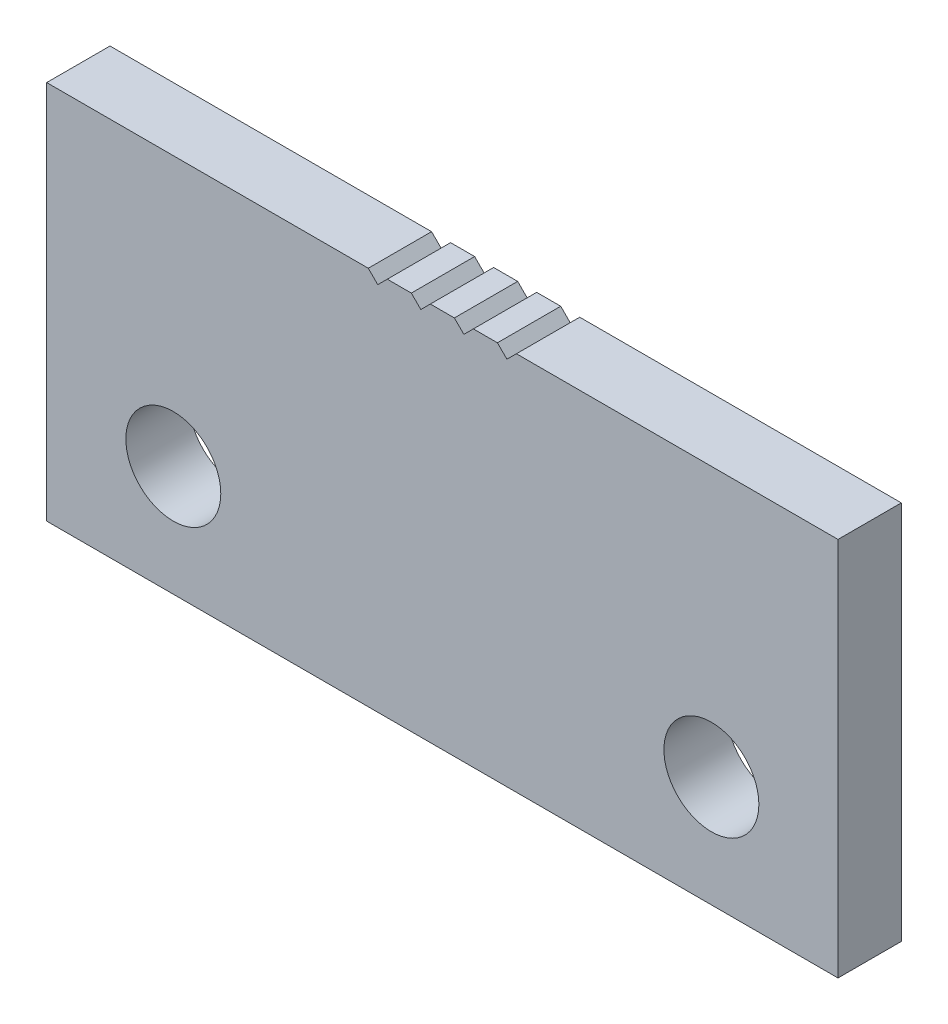
ISO-10303-21;
HEADER;
FILE_DESCRIPTION(('STEP AP214'),'2;1');
FILE_NAME('part.step','',(''),(''),'','','');
FILE_SCHEMA(('AUTOMOTIVE_DESIGN { 1 0 10303 214 1 1 1 1 }'));
ENDSEC;
DATA;
#1=APPLICATION_CONTEXT('core data for automotive mechanical design processes');
#2=APPLICATION_PROTOCOL_DEFINITION('international standard','automotive_design',2000,#1);
#3=PRODUCT_CONTEXT('',#1,'mechanical');
#4=PRODUCT('Part','Part','',(#3));
#5=PRODUCT_RELATED_PRODUCT_CATEGORY('part','',(#4));
#6=PRODUCT_DEFINITION_FORMATION('','',#4);
#7=PRODUCT_DEFINITION_CONTEXT('part definition',#1,'design');
#8=PRODUCT_DEFINITION('design','',#6,#7);
#9=PRODUCT_DEFINITION_SHAPE('','',#8);
#10=(LENGTH_UNIT() NAMED_UNIT(*) SI_UNIT(.MILLI.,.METRE.));
#11=(NAMED_UNIT(*) PLANE_ANGLE_UNIT() SI_UNIT($,.RADIAN.));
#12=(NAMED_UNIT(*) SI_UNIT($,.STERADIAN.) SOLID_ANGLE_UNIT());
#13=UNCERTAINTY_MEASURE_WITH_UNIT(LENGTH_MEASURE(1.E-05),#10,'distance_accuracy_value','');
#14=(GEOMETRIC_REPRESENTATION_CONTEXT(3) GLOBAL_UNCERTAINTY_ASSIGNED_CONTEXT((#13)) GLOBAL_UNIT_ASSIGNED_CONTEXT((#10,
#11,#12)) REPRESENTATION_CONTEXT('',''));
#15=CARTESIAN_POINT('',(0.,0.,0.));
#16=DIRECTION('',(0.,0.,1.));
#17=DIRECTION('',(1.,0.,0.));
#18=AXIS2_PLACEMENT_3D('',#15,#16,#17);
#19=CARTESIAN_POINT('',(0.,0.,2.));
#20=DIRECTION('',(0.,0.,1.));
#21=DIRECTION('',(1.,0.,0.));
#22=AXIS2_PLACEMENT_3D('',#19,#20,#21);
#23=PLANE('',#22);
#24=CARTESIAN_POINT('',(8.5,-2.50000000000001,2.));
#25=DIRECTION('',(0.,0.,1.));
#26=DIRECTION('',(1.,0.,0.));
#27=AXIS2_PLACEMENT_3D('',#24,#25,#26);
#28=CIRCLE('',#27,1.5);
#29=CARTESIAN_POINT('',(10.,-2.50000000000001,2.));
#30=VERTEX_POINT('',#29);
#31=EDGE_CURVE('E198',#30,#30,#28,.T.);
#32=ORIENTED_EDGE('',*,*,#31,.F.);
#33=EDGE_LOOP('',(#32));
#34=FACE_BOUND('',#33,.T.);
#35=DIRECTION('',(-1.,0.,0.));
#36=VECTOR('',#35,1.);
#37=CARTESIAN_POINT('',(2.34,5.99999999999999,2.));
#38=LINE('',#37,#36);
#39=CARTESIAN_POINT('',(12.5,5.99999999999999,2.));
#40=VERTEX_POINT('',#39);
#41=CARTESIAN_POINT('',(2.34,5.99999999999999,2.));
#42=VERTEX_POINT('',#41);
#43=EDGE_CURVE('E240',#40,#42,#38,.T.);
#44=ORIENTED_EDGE('',*,*,#43,.T.);
#45=DIRECTION('',(-0.707106781186549,-0.707106781186547,0.));
#46=VECTOR('',#45,1.);
#47=CARTESIAN_POINT('',(2.04,5.69999999999999,2.));
#48=LINE('',#47,#46);
#49=CARTESIAN_POINT('',(2.04,5.69999999999999,2.));
#50=VERTEX_POINT('',#49);
#51=EDGE_CURVE('E128',#42,#50,#48,.T.);
#52=ORIENTED_EDGE('',*,*,#51,.T.);
#53=DIRECTION('',(-0.707106781186547,0.707106781186547,0.));
#54=VECTOR('',#53,1.);
#55=CARTESIAN_POINT('',(1.74,5.99999999999999,2.));
#56=LINE('',#55,#54);
#57=CARTESIAN_POINT('',(1.74,5.99999999999999,2.));
#58=VERTEX_POINT('',#57);
#59=EDGE_CURVE('E293',#50,#58,#56,.T.);
#60=ORIENTED_EDGE('',*,*,#59,.T.);
#61=DIRECTION('',(-1.,0.,0.));
#62=VECTOR('',#61,1.);
#63=CARTESIAN_POINT('',(0.980000000000001,5.99999999999999,2.));
#64=LINE('',#63,#62);
#65=CARTESIAN_POINT('',(0.980000000000001,5.99999999999999,2.));
#66=VERTEX_POINT('',#65);
#67=EDGE_CURVE('E313',#58,#66,#64,.T.);
#68=ORIENTED_EDGE('',*,*,#67,.T.);
#69=DIRECTION('',(-0.707106781186549,-0.707106781186547,0.));
#70=VECTOR('',#69,1.);
#71=CARTESIAN_POINT('',(0.68,5.69999999999999,2.));
#72=LINE('',#71,#70);
#73=CARTESIAN_POINT('',(0.68,5.69999999999999,2.));
#74=VERTEX_POINT('',#73);
#75=EDGE_CURVE('E309',#66,#74,#72,.T.);
#76=ORIENTED_EDGE('',*,*,#75,.T.);
#77=DIRECTION('',(-0.707106781186547,0.707106781186547,0.));
#78=VECTOR('',#77,1.);
#79=CARTESIAN_POINT('',(0.38,5.99999999999999,2.));
#80=LINE('',#79,#78);
#81=CARTESIAN_POINT('',(0.38,5.99999999999999,2.));
#82=VERTEX_POINT('',#81);
#83=EDGE_CURVE('E312',#74,#82,#80,.T.);
#84=ORIENTED_EDGE('',*,*,#83,.T.);
#85=DIRECTION('',(-1.,0.,0.));
#86=VECTOR('',#85,1.);
#87=CARTESIAN_POINT('',(-0.379999999999999,5.99999999999999,2.));
#88=LINE('',#87,#86);
#89=CARTESIAN_POINT('',(-0.379999999999999,5.99999999999999,2.));
#90=VERTEX_POINT('',#89);
#91=EDGE_CURVE('E317',#82,#90,#88,.T.);
#92=ORIENTED_EDGE('',*,*,#91,.T.);
#93=DIRECTION('',(-0.707106781186549,-0.707106781186547,0.));
#94=VECTOR('',#93,1.);
#95=CARTESIAN_POINT('',(-0.68,5.69999999999999,2.));
#96=LINE('',#95,#94);
#97=CARTESIAN_POINT('',(-0.68,5.69999999999999,2.));
#98=VERTEX_POINT('',#97);
#99=EDGE_CURVE('E324',#90,#98,#96,.T.);
#100=ORIENTED_EDGE('',*,*,#99,.T.);
#101=DIRECTION('',(-0.707106781186547,0.707106781186547,0.));
#102=VECTOR('',#101,1.);
#103=CARTESIAN_POINT('',(-0.98,5.99999999999999,2.));
#104=LINE('',#103,#102);
#105=CARTESIAN_POINT('',(-0.98,5.99999999999999,2.));
#106=VERTEX_POINT('',#105);
#107=EDGE_CURVE('E327',#98,#106,#104,.T.);
#108=ORIENTED_EDGE('',*,*,#107,.T.);
#109=DIRECTION('',(-1.,0.,0.));
#110=VECTOR('',#109,1.);
#111=CARTESIAN_POINT('',(-1.74,5.99999999999999,2.));
#112=LINE('',#111,#110);
#113=CARTESIAN_POINT('',(-1.74,5.99999999999999,2.));
#114=VERTEX_POINT('',#113);
#115=EDGE_CURVE('E330',#106,#114,#112,.T.);
#116=ORIENTED_EDGE('',*,*,#115,.T.);
#117=DIRECTION('',(-0.707106781186549,-0.707106781186547,0.));
#118=VECTOR('',#117,1.);
#119=CARTESIAN_POINT('',(-2.04,5.69999999999999,2.));
#120=LINE('',#119,#118);
#121=CARTESIAN_POINT('',(-2.04,5.69999999999999,2.));
#122=VERTEX_POINT('',#121);
#123=EDGE_CURVE('E333',#114,#122,#120,.T.);
#124=ORIENTED_EDGE('',*,*,#123,.T.);
#125=DIRECTION('',(-0.707106781186547,0.707106781186547,0.));
#126=VECTOR('',#125,1.);
#127=CARTESIAN_POINT('',(-2.34,5.99999999999999,2.));
#128=LINE('',#127,#126);
#129=CARTESIAN_POINT('',(-2.34,5.99999999999999,2.));
#130=VERTEX_POINT('',#129);
#131=EDGE_CURVE('E336',#122,#130,#128,.T.);
#132=ORIENTED_EDGE('',*,*,#131,.T.);
#133=DIRECTION('',(-1.,0.,0.));
#134=VECTOR('',#133,1.);
#135=CARTESIAN_POINT('',(-12.5,5.99999999999999,2.));
#136=LINE('',#135,#134);
#137=CARTESIAN_POINT('',(-12.5,5.99999999999999,2.));
#138=VERTEX_POINT('',#137);
#139=EDGE_CURVE('E171',#130,#138,#136,.T.);
#140=ORIENTED_EDGE('',*,*,#139,.T.);
#141=DIRECTION('',(0.,-1.,0.));
#142=VECTOR('',#141,1.);
#143=CARTESIAN_POINT('',(-12.5,-6.00000000000001,2.));
#144=LINE('',#143,#142);
#145=CARTESIAN_POINT('',(-12.5,-6.00000000000001,2.));
#146=VERTEX_POINT('',#145);
#147=EDGE_CURVE('E165',#138,#146,#144,.T.);
#148=ORIENTED_EDGE('',*,*,#147,.T.);
#149=DIRECTION('',(1.,0.,0.));
#150=VECTOR('',#149,1.);
#151=CARTESIAN_POINT('',(-12.5,-6.00000000000001,2.));
#152=LINE('',#151,#150);
#153=CARTESIAN_POINT('',(12.5,-6.00000000000001,2.));
#154=VERTEX_POINT('',#153);
#155=EDGE_CURVE('E169',#146,#154,#152,.T.);
#156=ORIENTED_EDGE('',*,*,#155,.T.);
#157=DIRECTION('',(0.,1.,0.));
#158=VECTOR('',#157,1.);
#159=CARTESIAN_POINT('',(12.5,-6.00000000000001,2.));
#160=LINE('',#159,#158);
#161=EDGE_CURVE('E61',#154,#40,#160,.T.);
#162=ORIENTED_EDGE('',*,*,#161,.T.);
#163=EDGE_LOOP('',(#44,#52,#60,#68,#76,#84,#92,#100,#108,#116,#124,#132,#140,#148,#156,#162));
#164=FACE_BOUND('',#163,.T.);
#165=CARTESIAN_POINT('',(-8.5,-2.50000000000001,2.));
#166=DIRECTION('',(0.,0.,1.));
#167=DIRECTION('',(1.,0.,0.));
#168=AXIS2_PLACEMENT_3D('',#165,#166,#167);
#169=CIRCLE('',#168,1.5);
#170=CARTESIAN_POINT('',(-7.,-2.50000000000001,2.));
#171=VERTEX_POINT('',#170);
#172=EDGE_CURVE('E380',#171,#171,#169,.T.);
#173=ORIENTED_EDGE('',*,*,#172,.F.);
#174=EDGE_LOOP('',(#173));
#175=FACE_BOUND('',#174,.T.);
#176=ADVANCED_FACE('F43',(#34,#164,#175),#23,.T.);
#177=CARTESIAN_POINT('',(0.,0.,0.));
#178=DIRECTION('',(0.,0.,1.));
#179=DIRECTION('',(1.,0.,0.));
#180=AXIS2_PLACEMENT_3D('',#177,#178,#179);
#181=PLANE('',#180);
#182=DIRECTION('',(-1.,0.,0.));
#183=VECTOR('',#182,1.);
#184=CARTESIAN_POINT('',(2.34,5.99999999999999,0.));
#185=LINE('',#184,#183);
#186=CARTESIAN_POINT('',(12.5,5.99999999999999,0.));
#187=VERTEX_POINT('',#186);
#188=CARTESIAN_POINT('',(2.34,5.99999999999999,0.));
#189=VERTEX_POINT('',#188);
#190=EDGE_CURVE('E193',#187,#189,#185,.T.);
#191=ORIENTED_EDGE('',*,*,#190,.F.);
#192=DIRECTION('',(0.,1.,0.));
#193=VECTOR('',#192,1.);
#194=CARTESIAN_POINT('',(12.5,-6.00000000000001,0.));
#195=LINE('',#194,#193);
#196=CARTESIAN_POINT('',(12.5,-6.00000000000001,0.));
#197=VERTEX_POINT('',#196);
#198=EDGE_CURVE('E120',#197,#187,#195,.T.);
#199=ORIENTED_EDGE('',*,*,#198,.F.);
#200=DIRECTION('',(1.,0.,0.));
#201=VECTOR('',#200,1.);
#202=CARTESIAN_POINT('',(-12.5,-6.00000000000001,0.));
#203=LINE('',#202,#201);
#204=CARTESIAN_POINT('',(-12.5,-6.00000000000001,0.));
#205=VERTEX_POINT('',#204);
#206=EDGE_CURVE('E114',#205,#197,#203,.T.);
#207=ORIENTED_EDGE('',*,*,#206,.F.);
#208=DIRECTION('',(0.,-1.,0.));
#209=VECTOR('',#208,1.);
#210=CARTESIAN_POINT('',(-12.5,-6.00000000000001,0.));
#211=LINE('',#210,#209);
#212=CARTESIAN_POINT('',(-12.5,5.99999999999999,0.));
#213=VERTEX_POINT('',#212);
#214=EDGE_CURVE('E180',#213,#205,#211,.T.);
#215=ORIENTED_EDGE('',*,*,#214,.F.);
#216=DIRECTION('',(-1.,0.,0.));
#217=VECTOR('',#216,1.);
#218=CARTESIAN_POINT('',(-12.5,5.99999999999999,0.));
#219=LINE('',#218,#217);
#220=CARTESIAN_POINT('',(-2.34,5.99999999999999,0.));
#221=VERTEX_POINT('',#220);
#222=EDGE_CURVE('E231',#221,#213,#219,.T.);
#223=ORIENTED_EDGE('',*,*,#222,.F.);
#224=DIRECTION('',(-0.707106781186547,0.707106781186547,0.));
#225=VECTOR('',#224,1.);
#226=CARTESIAN_POINT('',(-2.34,5.99999999999999,0.));
#227=LINE('',#226,#225);
#228=CARTESIAN_POINT('',(-2.04,5.69999999999999,0.));
#229=VERTEX_POINT('',#228);
#230=EDGE_CURVE('E228',#229,#221,#227,.T.);
#231=ORIENTED_EDGE('',*,*,#230,.F.);
#232=DIRECTION('',(-0.707106781186549,-0.707106781186547,0.));
#233=VECTOR('',#232,1.);
#234=CARTESIAN_POINT('',(-2.04,5.69999999999999,0.));
#235=LINE('',#234,#233);
#236=CARTESIAN_POINT('',(-1.74,5.99999999999999,0.));
#237=VERTEX_POINT('',#236);
#238=EDGE_CURVE('E225',#237,#229,#235,.T.);
#239=ORIENTED_EDGE('',*,*,#238,.F.);
#240=DIRECTION('',(-1.,0.,0.));
#241=VECTOR('',#240,1.);
#242=CARTESIAN_POINT('',(-1.74,5.99999999999999,0.));
#243=LINE('',#242,#241);
#244=CARTESIAN_POINT('',(-0.98,5.99999999999999,0.));
#245=VERTEX_POINT('',#244);
#246=EDGE_CURVE('E222',#245,#237,#243,.T.);
#247=ORIENTED_EDGE('',*,*,#246,.F.);
#248=DIRECTION('',(-0.707106781186547,0.707106781186547,0.));
#249=VECTOR('',#248,1.);
#250=CARTESIAN_POINT('',(-0.98,5.99999999999999,0.));
#251=LINE('',#250,#249);
#252=CARTESIAN_POINT('',(-0.68,5.69999999999999,0.));
#253=VERTEX_POINT('',#252);
#254=EDGE_CURVE('E219',#253,#245,#251,.T.);
#255=ORIENTED_EDGE('',*,*,#254,.F.);
#256=DIRECTION('',(-0.707106781186549,-0.707106781186547,0.));
#257=VECTOR('',#256,1.);
#258=CARTESIAN_POINT('',(-0.68,5.69999999999999,0.));
#259=LINE('',#258,#257);
#260=CARTESIAN_POINT('',(-0.379999999999999,5.99999999999999,0.));
#261=VERTEX_POINT('',#260);
#262=EDGE_CURVE('E216',#261,#253,#259,.T.);
#263=ORIENTED_EDGE('',*,*,#262,.F.);
#264=DIRECTION('',(-1.,0.,0.));
#265=VECTOR('',#264,1.);
#266=CARTESIAN_POINT('',(-0.379999999999999,5.99999999999999,0.));
#267=LINE('',#266,#265);
#268=CARTESIAN_POINT('',(0.38,5.99999999999999,0.));
#269=VERTEX_POINT('',#268);
#270=EDGE_CURVE('E213',#269,#261,#267,.T.);
#271=ORIENTED_EDGE('',*,*,#270,.F.);
#272=DIRECTION('',(-0.707106781186547,0.707106781186547,0.));
#273=VECTOR('',#272,1.);
#274=CARTESIAN_POINT('',(0.38,5.99999999999999,0.));
#275=LINE('',#274,#273);
#276=CARTESIAN_POINT('',(0.68,5.69999999999999,0.));
#277=VERTEX_POINT('',#276);
#278=EDGE_CURVE('E210',#277,#269,#275,.T.);
#279=ORIENTED_EDGE('',*,*,#278,.F.);
#280=DIRECTION('',(-0.707106781186549,-0.707106781186547,0.));
#281=VECTOR('',#280,1.);
#282=CARTESIAN_POINT('',(0.68,5.69999999999999,0.));
#283=LINE('',#282,#281);
#284=CARTESIAN_POINT('',(0.980000000000001,5.99999999999999,0.));
#285=VERTEX_POINT('',#284);
#286=EDGE_CURVE('E207',#285,#277,#283,.T.);
#287=ORIENTED_EDGE('',*,*,#286,.F.);
#288=DIRECTION('',(-1.,0.,0.));
#289=VECTOR('',#288,1.);
#290=CARTESIAN_POINT('',(0.980000000000001,5.99999999999999,0.));
#291=LINE('',#290,#289);
#292=CARTESIAN_POINT('',(1.74,5.99999999999999,0.));
#293=VERTEX_POINT('',#292);
#294=EDGE_CURVE('E204',#293,#285,#291,.T.);
#295=ORIENTED_EDGE('',*,*,#294,.F.);
#296=DIRECTION('',(-0.707106781186547,0.707106781186547,0.));
#297=VECTOR('',#296,1.);
#298=CARTESIAN_POINT('',(1.74,5.99999999999999,0.));
#299=LINE('',#298,#297);
#300=CARTESIAN_POINT('',(2.04,5.69999999999999,0.));
#301=VERTEX_POINT('',#300);
#302=EDGE_CURVE('E201',#301,#293,#299,.T.);
#303=ORIENTED_EDGE('',*,*,#302,.F.);
#304=DIRECTION('',(-0.707106781186549,-0.707106781186547,0.));
#305=VECTOR('',#304,1.);
#306=CARTESIAN_POINT('',(2.04,5.69999999999999,0.));
#307=LINE('',#306,#305);
#308=EDGE_CURVE('E197',#189,#301,#307,.T.);
#309=ORIENTED_EDGE('',*,*,#308,.F.);
#310=EDGE_LOOP('',(#191,#199,#207,#215,#223,#231,#239,#247,#255,#263,#271,#279,#287,#295,#303,#309));
#311=FACE_BOUND('',#310,.T.);
#312=CARTESIAN_POINT('',(8.5,-2.50000000000001,0.));
#313=DIRECTION('',(0.,0.,1.));
#314=DIRECTION('',(1.,0.,0.));
#315=AXIS2_PLACEMENT_3D('',#312,#313,#314);
#316=CIRCLE('',#315,1.5);
#317=CARTESIAN_POINT('',(10.,-2.50000000000001,0.));
#318=VERTEX_POINT('',#317);
#319=EDGE_CURVE('E388',#318,#318,#316,.T.);
#320=ORIENTED_EDGE('',*,*,#319,.T.);
#321=EDGE_LOOP('',(#320));
#322=FACE_BOUND('',#321,.T.);
#323=CARTESIAN_POINT('',(-8.5,-2.50000000000001,0.));
#324=DIRECTION('',(0.,0.,1.));
#325=DIRECTION('',(1.,0.,0.));
#326=AXIS2_PLACEMENT_3D('',#323,#324,#325);
#327=CIRCLE('',#326,1.5);
#328=CARTESIAN_POINT('',(-7.,-2.50000000000001,0.));
#329=VERTEX_POINT('',#328);
#330=EDGE_CURVE('E383',#329,#329,#327,.T.);
#331=ORIENTED_EDGE('',*,*,#330,.T.);
#332=EDGE_LOOP('',(#331));
#333=FACE_BOUND('',#332,.T.);
#334=ADVANCED_FACE('F297',(#311,#322,#333),#181,.F.);
#335=CARTESIAN_POINT('',(2.34,5.99999999999999,2.));
#336=DIRECTION('',(0.,-1.,0.));
#337=DIRECTION('',(0.,0.,-1.));
#338=AXIS2_PLACEMENT_3D('',#335,#336,#337);
#339=PLANE('',#338);
#340=ORIENTED_EDGE('',*,*,#190,.T.);
#341=DIRECTION('',(0.,0.,-1.));
#342=VECTOR('',#341,1.);
#343=CARTESIAN_POINT('',(2.34,5.99999999999999,2.));
#344=LINE('',#343,#342);
#345=EDGE_CURVE('E11',#42,#189,#344,.T.);
#346=ORIENTED_EDGE('',*,*,#345,.F.);
#347=ORIENTED_EDGE('',*,*,#43,.F.);
#348=DIRECTION('',(0.,0.,-1.));
#349=VECTOR('',#348,1.);
#350=CARTESIAN_POINT('',(12.5,5.99999999999999,2.));
#351=LINE('',#350,#349);
#352=EDGE_CURVE('E189',#40,#187,#351,.T.);
#353=ORIENTED_EDGE('',*,*,#352,.T.);
#354=EDGE_LOOP('',(#340,#346,#347,#353));
#355=FACE_BOUND('',#354,.T.);
#356=ADVANCED_FACE('F45',(#355),#339,.F.);
#357=CARTESIAN_POINT('',(2.04,5.69999999999999,2.));
#358=DIRECTION('',(0.707106781186547,-0.707106781186549,0.));
#359=DIRECTION('',(0.707106781186549,0.707106781186547,0.));
#360=AXIS2_PLACEMENT_3D('',#357,#358,#359);
#361=PLANE('',#360);
#362=ORIENTED_EDGE('',*,*,#308,.T.);
#363=DIRECTION('',(0.,0.,-1.));
#364=VECTOR('',#363,1.);
#365=CARTESIAN_POINT('',(2.04,5.69999999999999,2.));
#366=LINE('',#365,#364);
#367=EDGE_CURVE('E53',#50,#301,#366,.T.);
#368=ORIENTED_EDGE('',*,*,#367,.F.);
#369=ORIENTED_EDGE('',*,*,#51,.F.);
#370=ORIENTED_EDGE('',*,*,#345,.T.);
#371=EDGE_LOOP('',(#362,#368,#369,#370));
#372=FACE_BOUND('',#371,.T.);
#373=ADVANCED_FACE('F540',(#372),#361,.F.);
#374=CARTESIAN_POINT('',(1.74,5.99999999999999,2.));
#375=DIRECTION('',(-0.707106781186547,-0.707106781186547,0.));
#376=DIRECTION('',(0.707106781186548,-0.707106781186548,0.));
#377=AXIS2_PLACEMENT_3D('',#374,#375,#376);
#378=PLANE('',#377);
#379=ORIENTED_EDGE('',*,*,#302,.T.);
#380=DIRECTION('',(0.,0.,-1.));
#381=VECTOR('',#380,1.);
#382=CARTESIAN_POINT('',(1.74,5.99999999999999,2.));
#383=LINE('',#382,#381);
#384=EDGE_CURVE('E283',#58,#293,#383,.T.);
#385=ORIENTED_EDGE('',*,*,#384,.F.);
#386=ORIENTED_EDGE('',*,*,#59,.F.);
#387=ORIENTED_EDGE('',*,*,#367,.T.);
#388=EDGE_LOOP('',(#379,#385,#386,#387));
#389=FACE_BOUND('',#388,.T.);
#390=ADVANCED_FACE('F291',(#389),#378,.F.);
#391=CARTESIAN_POINT('',(0.980000000000001,5.99999999999999,2.));
#392=DIRECTION('',(0.,-1.,0.));
#393=DIRECTION('',(0.,0.,-1.));
#394=AXIS2_PLACEMENT_3D('',#391,#392,#393);
#395=PLANE('',#394);
#396=ORIENTED_EDGE('',*,*,#294,.T.);
#397=DIRECTION('',(0.,0.,-1.));
#398=VECTOR('',#397,1.);
#399=CARTESIAN_POINT('',(0.980000000000001,5.99999999999999,2.));
#400=LINE('',#399,#398);
#401=EDGE_CURVE('E279',#66,#285,#400,.T.);
#402=ORIENTED_EDGE('',*,*,#401,.F.);
#403=ORIENTED_EDGE('',*,*,#67,.F.);
#404=ORIENTED_EDGE('',*,*,#384,.T.);
#405=EDGE_LOOP('',(#396,#402,#403,#404));
#406=FACE_BOUND('',#405,.T.);
#407=ADVANCED_FACE('F303',(#406),#395,.F.);
#408=CARTESIAN_POINT('',(0.68,5.69999999999999,2.));
#409=DIRECTION('',(0.707106781186547,-0.707106781186549,0.));
#410=DIRECTION('',(0.707106781186549,0.707106781186547,0.));
#411=AXIS2_PLACEMENT_3D('',#408,#409,#410);
#412=PLANE('',#411);
#413=ORIENTED_EDGE('',*,*,#286,.T.);
#414=DIRECTION('',(0.,0.,-1.));
#415=VECTOR('',#414,1.);
#416=CARTESIAN_POINT('',(0.68,5.69999999999999,2.));
#417=LINE('',#416,#415);
#418=EDGE_CURVE('E275',#74,#277,#417,.T.);
#419=ORIENTED_EDGE('',*,*,#418,.F.);
#420=ORIENTED_EDGE('',*,*,#75,.F.);
#421=ORIENTED_EDGE('',*,*,#401,.T.);
#422=EDGE_LOOP('',(#413,#419,#420,#421));
#423=FACE_BOUND('',#422,.T.);
#424=ADVANCED_FACE('F307',(#423),#412,.F.);
#425=CARTESIAN_POINT('',(0.38,5.99999999999999,2.));
#426=DIRECTION('',(-0.707106781186547,-0.707106781186547,0.));
#427=DIRECTION('',(0.707106781186548,-0.707106781186548,0.));
#428=AXIS2_PLACEMENT_3D('',#425,#426,#427);
#429=PLANE('',#428);
#430=ORIENTED_EDGE('',*,*,#278,.T.);
#431=DIRECTION('',(0.,0.,-1.));
#432=VECTOR('',#431,1.);
#433=CARTESIAN_POINT('',(0.38,5.99999999999999,2.));
#434=LINE('',#433,#432);
#435=EDGE_CURVE('E271',#82,#269,#434,.T.);
#436=ORIENTED_EDGE('',*,*,#435,.F.);
#437=ORIENTED_EDGE('',*,*,#83,.F.);
#438=ORIENTED_EDGE('',*,*,#418,.T.);
#439=EDGE_LOOP('',(#430,#436,#437,#438));
#440=FACE_BOUND('',#439,.T.);
#441=ADVANCED_FACE('F501',(#440),#429,.F.);
#442=CARTESIAN_POINT('',(-0.379999999999999,5.99999999999999,2.));
#443=DIRECTION('',(0.,-1.,0.));
#444=DIRECTION('',(0.,0.,-1.));
#445=AXIS2_PLACEMENT_3D('',#442,#443,#444);
#446=PLANE('',#445);
#447=ORIENTED_EDGE('',*,*,#270,.T.);
#448=DIRECTION('',(0.,0.,-1.));
#449=VECTOR('',#448,1.);
#450=CARTESIAN_POINT('',(-0.379999999999999,5.99999999999999,2.));
#451=LINE('',#450,#449);
#452=EDGE_CURVE('E267',#90,#261,#451,.T.);
#453=ORIENTED_EDGE('',*,*,#452,.F.);
#454=ORIENTED_EDGE('',*,*,#91,.F.);
#455=ORIENTED_EDGE('',*,*,#435,.T.);
#456=EDGE_LOOP('',(#447,#453,#454,#455));
#457=FACE_BOUND('',#456,.T.);
#458=ADVANCED_FACE('F490',(#457),#446,.F.);
#459=CARTESIAN_POINT('',(-0.68,5.69999999999999,2.));
#460=DIRECTION('',(0.707106781186547,-0.707106781186549,0.));
#461=DIRECTION('',(0.707106781186549,0.707106781186547,0.));
#462=AXIS2_PLACEMENT_3D('',#459,#460,#461);
#463=PLANE('',#462);
#464=ORIENTED_EDGE('',*,*,#262,.T.);
#465=DIRECTION('',(0.,0.,-1.));
#466=VECTOR('',#465,1.);
#467=CARTESIAN_POINT('',(-0.68,5.69999999999999,2.));
#468=LINE('',#467,#466);
#469=EDGE_CURVE('E263',#98,#253,#468,.T.);
#470=ORIENTED_EDGE('',*,*,#469,.F.);
#471=ORIENTED_EDGE('',*,*,#99,.F.);
#472=ORIENTED_EDGE('',*,*,#452,.T.);
#473=EDGE_LOOP('',(#464,#470,#471,#472));
#474=FACE_BOUND('',#473,.T.);
#475=ADVANCED_FACE('F479',(#474),#463,.F.);
#476=CARTESIAN_POINT('',(-0.98,5.99999999999999,2.));
#477=DIRECTION('',(-0.707106781186547,-0.707106781186547,0.));
#478=DIRECTION('',(0.707106781186548,-0.707106781186548,0.));
#479=AXIS2_PLACEMENT_3D('',#476,#477,#478);
#480=PLANE('',#479);
#481=ORIENTED_EDGE('',*,*,#254,.T.);
#482=DIRECTION('',(0.,0.,-1.));
#483=VECTOR('',#482,1.);
#484=CARTESIAN_POINT('',(-0.98,5.99999999999999,2.));
#485=LINE('',#484,#483);
#486=EDGE_CURVE('E259',#106,#245,#485,.T.);
#487=ORIENTED_EDGE('',*,*,#486,.F.);
#488=ORIENTED_EDGE('',*,*,#107,.F.);
#489=ORIENTED_EDGE('',*,*,#469,.T.);
#490=EDGE_LOOP('',(#481,#487,#488,#489));
#491=FACE_BOUND('',#490,.T.);
#492=ADVANCED_FACE('F468',(#491),#480,.F.);
#493=CARTESIAN_POINT('',(-1.74,5.99999999999999,2.));
#494=DIRECTION('',(0.,-1.,0.));
#495=DIRECTION('',(0.,0.,-1.));
#496=AXIS2_PLACEMENT_3D('',#493,#494,#495);
#497=PLANE('',#496);
#498=ORIENTED_EDGE('',*,*,#246,.T.);
#499=DIRECTION('',(0.,0.,-1.));
#500=VECTOR('',#499,1.);
#501=CARTESIAN_POINT('',(-1.74,5.99999999999999,2.));
#502=LINE('',#501,#500);
#503=EDGE_CURVE('E255',#114,#237,#502,.T.);
#504=ORIENTED_EDGE('',*,*,#503,.F.);
#505=ORIENTED_EDGE('',*,*,#115,.F.);
#506=ORIENTED_EDGE('',*,*,#486,.T.);
#507=EDGE_LOOP('',(#498,#504,#505,#506));
#508=FACE_BOUND('',#507,.T.);
#509=ADVANCED_FACE('F457',(#508),#497,.F.);
#510=CARTESIAN_POINT('',(-2.04,5.69999999999999,2.));
#511=DIRECTION('',(0.707106781186547,-0.707106781186549,0.));
#512=DIRECTION('',(0.707106781186549,0.707106781186547,0.));
#513=AXIS2_PLACEMENT_3D('',#510,#511,#512);
#514=PLANE('',#513);
#515=ORIENTED_EDGE('',*,*,#238,.T.);
#516=DIRECTION('',(0.,0.,-1.));
#517=VECTOR('',#516,1.);
#518=CARTESIAN_POINT('',(-2.04,5.69999999999999,2.));
#519=LINE('',#518,#517);
#520=EDGE_CURVE('E251',#122,#229,#519,.T.);
#521=ORIENTED_EDGE('',*,*,#520,.F.);
#522=ORIENTED_EDGE('',*,*,#123,.F.);
#523=ORIENTED_EDGE('',*,*,#503,.T.);
#524=EDGE_LOOP('',(#515,#521,#522,#523));
#525=FACE_BOUND('',#524,.T.);
#526=ADVANCED_FACE('F447',(#525),#514,.F.);
#527=CARTESIAN_POINT('',(-2.34,5.99999999999999,2.));
#528=DIRECTION('',(-0.707106781186547,-0.707106781186547,0.));
#529=DIRECTION('',(0.707106781186548,-0.707106781186548,0.));
#530=AXIS2_PLACEMENT_3D('',#527,#528,#529);
#531=PLANE('',#530);
#532=ORIENTED_EDGE('',*,*,#230,.T.);
#533=DIRECTION('',(0.,0.,-1.));
#534=VECTOR('',#533,1.);
#535=CARTESIAN_POINT('',(-2.34,5.99999999999999,2.));
#536=LINE('',#535,#534);
#537=EDGE_CURVE('E247',#130,#221,#536,.T.);
#538=ORIENTED_EDGE('',*,*,#537,.F.);
#539=ORIENTED_EDGE('',*,*,#131,.F.);
#540=ORIENTED_EDGE('',*,*,#520,.T.);
#541=EDGE_LOOP('',(#532,#538,#539,#540));
#542=FACE_BOUND('',#541,.T.);
#543=ADVANCED_FACE('F344',(#542),#531,.F.);
#544=CARTESIAN_POINT('',(-12.5,5.99999999999999,2.));
#545=DIRECTION('',(0.,-1.,0.));
#546=DIRECTION('',(0.,0.,-1.));
#547=AXIS2_PLACEMENT_3D('',#544,#545,#546);
#548=PLANE('',#547);
#549=ORIENTED_EDGE('',*,*,#222,.T.);
#550=DIRECTION('',(0.,0.,-1.));
#551=VECTOR('',#550,1.);
#552=CARTESIAN_POINT('',(-12.5,5.99999999999999,2.));
#553=LINE('',#552,#551);
#554=EDGE_CURVE('E182',#138,#213,#553,.T.);
#555=ORIENTED_EDGE('',*,*,#554,.F.);
#556=ORIENTED_EDGE('',*,*,#139,.F.);
#557=ORIENTED_EDGE('',*,*,#537,.T.);
#558=EDGE_LOOP('',(#549,#555,#556,#557));
#559=FACE_BOUND('',#558,.T.);
#560=ADVANCED_FACE('F348',(#559),#548,.F.);
#561=CARTESIAN_POINT('',(-12.5,-6.00000000000001,2.));
#562=DIRECTION('',(1.,0.,0.));
#563=DIRECTION('',(0.,0.,-1.));
#564=AXIS2_PLACEMENT_3D('',#561,#562,#563);
#565=PLANE('',#564);
#566=ORIENTED_EDGE('',*,*,#214,.T.);
#567=DIRECTION('',(0.,0.,-1.));
#568=VECTOR('',#567,1.);
#569=CARTESIAN_POINT('',(-12.5,-6.00000000000001,2.));
#570=LINE('',#569,#568);
#571=EDGE_CURVE('E177',#146,#205,#570,.T.);
#572=ORIENTED_EDGE('',*,*,#571,.F.);
#573=ORIENTED_EDGE('',*,*,#147,.F.);
#574=ORIENTED_EDGE('',*,*,#554,.T.);
#575=EDGE_LOOP('',(#566,#572,#573,#574));
#576=FACE_BOUND('',#575,.T.);
#577=ADVANCED_FACE('F178',(#576),#565,.F.);
#578=CARTESIAN_POINT('',(-12.5,-6.00000000000001,2.));
#579=DIRECTION('',(0.,1.,0.));
#580=DIRECTION('',(0.,0.,1.));
#581=AXIS2_PLACEMENT_3D('',#578,#579,#580);
#582=PLANE('',#581);
#583=ORIENTED_EDGE('',*,*,#206,.T.);
#584=DIRECTION('',(0.,0.,-1.));
#585=VECTOR('',#584,1.);
#586=CARTESIAN_POINT('',(12.5,-6.00000000000001,2.));
#587=LINE('',#586,#585);
#588=EDGE_CURVE('E183',#154,#197,#587,.T.);
#589=ORIENTED_EDGE('',*,*,#588,.F.);
#590=ORIENTED_EDGE('',*,*,#155,.F.);
#591=ORIENTED_EDGE('',*,*,#571,.T.);
#592=EDGE_LOOP('',(#583,#589,#590,#591));
#593=FACE_BOUND('',#592,.T.);
#594=ADVANCED_FACE('F185',(#593),#582,.F.);
#595=CARTESIAN_POINT('',(12.5,-6.00000000000001,2.));
#596=DIRECTION('',(-1.,0.,0.));
#597=DIRECTION('',(0.,0.,1.));
#598=AXIS2_PLACEMENT_3D('',#595,#596,#597);
#599=PLANE('',#598);
#600=ORIENTED_EDGE('',*,*,#198,.T.);
#601=ORIENTED_EDGE('',*,*,#352,.F.);
#602=ORIENTED_EDGE('',*,*,#161,.F.);
#603=ORIENTED_EDGE('',*,*,#588,.T.);
#604=EDGE_LOOP('',(#600,#601,#602,#603));
#605=FACE_BOUND('',#604,.T.);
#606=ADVANCED_FACE('F352',(#605),#599,.F.);
#607=CARTESIAN_POINT('',(8.5,-2.50000000000001,2.));
#608=DIRECTION('',(0.,0.,-1.));
#609=DIRECTION('',(-1.,0.,0.));
#610=AXIS2_PLACEMENT_3D('',#607,#608,#609);
#611=CYLINDRICAL_SURFACE('',#610,1.5);
#612=ORIENTED_EDGE('',*,*,#31,.T.);
#613=EDGE_LOOP('',(#612));
#614=FACE_BOUND('',#613,.T.);
#615=ORIENTED_EDGE('',*,*,#319,.F.);
#616=EDGE_LOOP('',(#615));
#617=FACE_BOUND('',#616,.T.);
#618=ADVANCED_FACE('F354',(#614,#617),#611,.F.);
#619=CARTESIAN_POINT('',(-8.5,-2.50000000000001,2.));
#620=DIRECTION('',(0.,0.,-1.));
#621=DIRECTION('',(-1.,0.,0.));
#622=AXIS2_PLACEMENT_3D('',#619,#620,#621);
#623=CYLINDRICAL_SURFACE('',#622,1.5);
#624=ORIENTED_EDGE('',*,*,#172,.T.);
#625=EDGE_LOOP('',(#624));
#626=FACE_BOUND('',#625,.T.);
#627=ORIENTED_EDGE('',*,*,#330,.F.);
#628=EDGE_LOOP('',(#627));
#629=FACE_BOUND('',#628,.T.);
#630=ADVANCED_FACE('F360',(#626,#629),#623,.F.);
#631=CLOSED_SHELL('',(#176,#334,#356,#373,#390,#407,#424,#441,#458,#475,#492,#509,#526,#543,
#560,#577,#594,#606,#618,#630));
#632=MANIFOLD_SOLID_BREP('B2',#631);
#633=ADVANCED_BREP_SHAPE_REPRESENTATION('',(#18,#632),#14);
#634=SHAPE_DEFINITION_REPRESENTATION(#9,#633);
ENDSEC;
END-ISO-10303-21;
